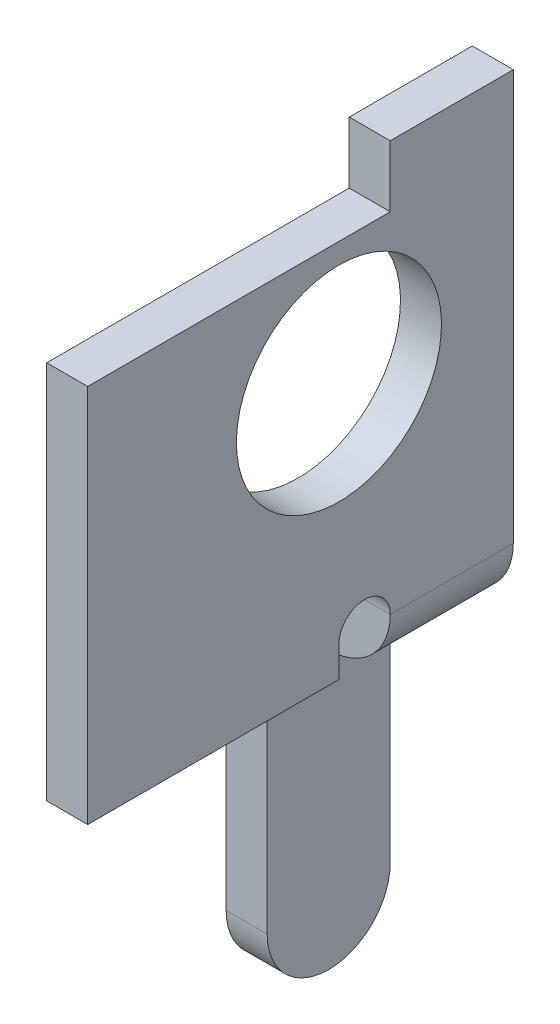
ISO-10303-21;
HEADER;
FILE_DESCRIPTION(('STEP AP214'),'2;1');
FILE_NAME('part.step','',(''),(''),'','','');
FILE_SCHEMA(('AUTOMOTIVE_DESIGN { 1 0 10303 214 1 1 1 1 }'));
ENDSEC;
DATA;
#1=APPLICATION_CONTEXT('core data for automotive mechanical design processes');
#2=APPLICATION_PROTOCOL_DEFINITION('international standard','automotive_design',2000,#1);
#3=PRODUCT_CONTEXT('',#1,'mechanical');
#4=PRODUCT('Part','Part','',(#3));
#5=PRODUCT_RELATED_PRODUCT_CATEGORY('part','',(#4));
#6=PRODUCT_DEFINITION_FORMATION('','',#4);
#7=PRODUCT_DEFINITION_CONTEXT('part definition',#1,'design');
#8=PRODUCT_DEFINITION('design','',#6,#7);
#9=PRODUCT_DEFINITION_SHAPE('','',#8);
#10=(LENGTH_UNIT() NAMED_UNIT(*) SI_UNIT(.MILLI.,.METRE.));
#11=(NAMED_UNIT(*) PLANE_ANGLE_UNIT() SI_UNIT($,.RADIAN.));
#12=(NAMED_UNIT(*) SI_UNIT($,.STERADIAN.) SOLID_ANGLE_UNIT());
#13=UNCERTAINTY_MEASURE_WITH_UNIT(LENGTH_MEASURE(1.E-05),#10,'distance_accuracy_value','');
#14=(GEOMETRIC_REPRESENTATION_CONTEXT(3) GLOBAL_UNCERTAINTY_ASSIGNED_CONTEXT((#13)) GLOBAL_UNIT_ASSIGNED_CONTEXT((#10,
#11,#12)) REPRESENTATION_CONTEXT('',''));
#15=CARTESIAN_POINT('',(0.,0.,0.));
#16=DIRECTION('',(0.,0.,1.));
#17=DIRECTION('',(1.,0.,0.));
#18=AXIS2_PLACEMENT_3D('',#15,#16,#17);
#19=CARTESIAN_POINT('',(-3.67305460142367,-0.513021259251257,-11.3));
#20=DIRECTION('',(0.,0.,-1.));
#21=DIRECTION('',(-1.,0.,0.));
#22=AXIS2_PLACEMENT_3D('',#19,#20,#21);
#23=PLANE('',#22);
#24=DIRECTION('',(0.,1.,0.));
#25=VECTOR('',#24,1.);
#26=CARTESIAN_POINT('',(-2.7,0.,-11.3));
#27=LINE('',#26,#25);
#28=CARTESIAN_POINT('',(-2.7,0.6,-11.3));
#29=VERTEX_POINT('',#28);
#30=CARTESIAN_POINT('',(-2.7,-1.9,-11.3));
#31=VERTEX_POINT('',#30);
#32=EDGE_CURVE('E163',#29,#31,#27,.F.);
#33=ORIENTED_EDGE('',*,*,#32,.F.);
#34=CARTESIAN_POINT('',(-2.5,0.6,-11.3));
#35=DIRECTION('',(0.,0.,1.));
#36=DIRECTION('',(1.,0.,0.));
#37=AXIS2_PLACEMENT_3D('',#34,#35,#36);
#38=CIRCLE('',#37,0.2);
#39=CARTESIAN_POINT('',(-2.5,0.8,-11.3));
#40=VERTEX_POINT('',#39);
#41=EDGE_CURVE('E169',#29,#40,#38,.F.);
#42=ORIENTED_EDGE('',*,*,#41,.T.);
#43=DIRECTION('',(-1.,0.,0.));
#44=VECTOR('',#43,1.);
#45=CARTESIAN_POINT('',(-3.67305460142367,0.8,-11.3));
#46=LINE('',#45,#44);
#47=CARTESIAN_POINT('',(-2.1,0.8,-11.3));
#48=VERTEX_POINT('',#47);
#49=EDGE_CURVE('E173',#48,#40,#46,.T.);
#50=ORIENTED_EDGE('',*,*,#49,.F.);
#51=CARTESIAN_POINT('',(-2.1,1.4,-11.3));
#52=DIRECTION('',(0.,0.,1.));
#53=DIRECTION('',(1.,0.,0.));
#54=AXIS2_PLACEMENT_3D('',#51,#52,#53);
#55=CIRCLE('',#54,0.6);
#56=CARTESIAN_POINT('',(-1.5,1.4,-11.3));
#57=VERTEX_POINT('',#56);
#58=EDGE_CURVE('E176',#57,#48,#55,.F.);
#59=ORIENTED_EDGE('',*,*,#58,.F.);
#60=DIRECTION('',(-1.,0.,0.));
#61=VECTOR('',#60,1.);
#62=CARTESIAN_POINT('',(-3.67305460142367,1.4,-11.3));
#63=LINE('',#62,#61);
#64=CARTESIAN_POINT('',(-1.9,1.4,-11.3));
#65=VERTEX_POINT('',#64);
#66=EDGE_CURVE('E177',#65,#57,#63,.F.);
#67=ORIENTED_EDGE('',*,*,#66,.F.);
#68=CARTESIAN_POINT('',(-2.1,1.4,-11.3));
#69=DIRECTION('',(0.,0.,1.));
#70=DIRECTION('',(1.,0.,0.));
#71=AXIS2_PLACEMENT_3D('',#68,#69,#70);
#72=CIRCLE('',#71,0.2);
#73=CARTESIAN_POINT('',(-2.1,1.2,-11.3));
#74=VERTEX_POINT('',#73);
#75=EDGE_CURVE('E179',#74,#65,#72,.T.);
#76=ORIENTED_EDGE('',*,*,#75,.F.);
#77=DIRECTION('',(-1.,0.,0.));
#78=VECTOR('',#77,1.);
#79=CARTESIAN_POINT('',(-3.67305460142367,1.2,-11.3));
#80=LINE('',#79,#78);
#81=CARTESIAN_POINT('',(-2.5,1.2,-11.3));
#82=VERTEX_POINT('',#81);
#83=EDGE_CURVE('E138',#82,#74,#80,.F.);
#84=ORIENTED_EDGE('',*,*,#83,.F.);
#85=CARTESIAN_POINT('',(-2.5,0.6,-11.3));
#86=DIRECTION('',(0.,0.,1.));
#87=DIRECTION('',(1.,0.,0.));
#88=AXIS2_PLACEMENT_3D('',#85,#86,#87);
#89=CIRCLE('',#88,0.6);
#90=CARTESIAN_POINT('',(-3.1,0.599999999999999,-11.3));
#91=VERTEX_POINT('',#90);
#92=EDGE_CURVE('E19',#91,#82,#89,.F.);
#93=ORIENTED_EDGE('',*,*,#92,.F.);
#94=DIRECTION('',(0.,1.,0.));
#95=VECTOR('',#94,1.);
#96=CARTESIAN_POINT('',(-3.1,0.599999999999996,-11.3));
#97=LINE('',#96,#95);
#98=CARTESIAN_POINT('',(-3.1,-1.9,-11.3));
#99=VERTEX_POINT('',#98);
#100=EDGE_CURVE('E135',#99,#91,#97,.T.);
#101=ORIENTED_EDGE('',*,*,#100,.F.);
#102=DIRECTION('',(-1.,0.,0.));
#103=VECTOR('',#102,1.);
#104=CARTESIAN_POINT('',(-4.5,-1.9,-11.3));
#105=LINE('',#104,#103);
#106=EDGE_CURVE('E170',#31,#99,#105,.T.);
#107=ORIENTED_EDGE('',*,*,#106,.F.);
#108=EDGE_LOOP('',(#33,#42,#50,#59,#67,#76,#84,#93,#101,#107));
#109=FACE_BOUND('',#108,.T.);
#110=ADVANCED_FACE('F16',(#109),#23,.F.);
#111=CARTESIAN_POINT('',(-4.5,-1.9,-11.9));
#112=DIRECTION('',(-1.,0.,0.));
#113=DIRECTION('',(0.,0.,1.));
#114=AXIS2_PLACEMENT_3D('',#111,#112,#113);
#115=CYLINDRICAL_SURFACE('',#114,0.6);
#116=DIRECTION('',(-1.,0.,0.));
#117=VECTOR('',#116,1.);
#118=CARTESIAN_POINT('',(-4.5,-1.9,-12.5));
#119=LINE('',#118,#117);
#120=CARTESIAN_POINT('',(-3.1,-1.9,-12.5));
#121=VERTEX_POINT('',#120);
#122=CARTESIAN_POINT('',(-2.7,-1.9,-12.5));
#123=VERTEX_POINT('',#122);
#124=EDGE_CURVE('E172',#121,#123,#119,.F.);
#125=ORIENTED_EDGE('',*,*,#124,.T.);
#126=CARTESIAN_POINT('',(-2.7,-1.9,-11.9));
#127=DIRECTION('',(-1.,0.,0.));
#128=DIRECTION('',(0.,0.,1.));
#129=AXIS2_PLACEMENT_3D('',#126,#127,#128);
#130=CIRCLE('',#129,0.6);
#131=EDGE_CURVE('E150',#31,#123,#130,.F.);
#132=ORIENTED_EDGE('',*,*,#131,.F.);
#133=ORIENTED_EDGE('',*,*,#106,.T.);
#134=CARTESIAN_POINT('',(-3.1,-1.9,-11.9));
#135=DIRECTION('',(-1.,0.,0.));
#136=DIRECTION('',(0.,0.,1.));
#137=AXIS2_PLACEMENT_3D('',#134,#135,#136);
#138=CIRCLE('',#137,0.6);
#139=EDGE_CURVE('E149',#121,#99,#138,.T.);
#140=ORIENTED_EDGE('',*,*,#139,.F.);
#141=EDGE_LOOP('',(#125,#132,#133,#140));
#142=FACE_BOUND('',#141,.T.);
#143=ADVANCED_FACE('F418',(#142),#115,.T.);
#144=CARTESIAN_POINT('',(-2.5,0.6,-11.3));
#145=DIRECTION('',(0.,0.,1.));
#146=DIRECTION('',(1.,0.,0.));
#147=AXIS2_PLACEMENT_3D('',#144,#145,#146);
#148=CYLINDRICAL_SURFACE('',#147,0.2);
#149=ORIENTED_EDGE('',*,*,#41,.F.);
#150=DIRECTION('',(0.,0.,1.));
#151=VECTOR('',#150,1.);
#152=CARTESIAN_POINT('',(-2.7,0.599999999999999,-11.3));
#153=LINE('',#152,#151);
#154=CARTESIAN_POINT('',(-2.7,0.6,-12.5));
#155=VERTEX_POINT('',#154);
#156=EDGE_CURVE('E166',#155,#29,#153,.T.);
#157=ORIENTED_EDGE('',*,*,#156,.F.);
#158=CARTESIAN_POINT('',(-2.5,0.6,-12.5));
#159=DIRECTION('',(0.,0.,1.));
#160=DIRECTION('',(1.,0.,0.));
#161=AXIS2_PLACEMENT_3D('',#158,#159,#160);
#162=CIRCLE('',#161,0.2);
#163=CARTESIAN_POINT('',(-2.5,0.8,-12.5));
#164=VERTEX_POINT('',#163);
#165=EDGE_CURVE('E200',#164,#155,#162,.T.);
#166=ORIENTED_EDGE('',*,*,#165,.F.);
#167=DIRECTION('',(0.,0.,1.));
#168=VECTOR('',#167,1.);
#169=CARTESIAN_POINT('',(-2.5,0.8,-11.3));
#170=LINE('',#169,#168);
#171=EDGE_CURVE('E234',#40,#164,#170,.F.);
#172=ORIENTED_EDGE('',*,*,#171,.F.);
#173=EDGE_LOOP('',(#149,#157,#166,#172));
#174=FACE_BOUND('',#173,.T.);
#175=ADVANCED_FACE('F415',(#174),#148,.F.);
#176=CARTESIAN_POINT('',(-2.7,0.,-11.3));
#177=DIRECTION('',(1.,0.,0.));
#178=DIRECTION('',(0.,1.,0.));
#179=AXIS2_PLACEMENT_3D('',#176,#177,#178);
#180=PLANE('',#179);
#181=ORIENTED_EDGE('',*,*,#32,.T.);
#182=ORIENTED_EDGE('',*,*,#131,.T.);
#183=DIRECTION('',(0.,1.,0.));
#184=VECTOR('',#183,1.);
#185=CARTESIAN_POINT('',(-2.7,-0.513021259251257,-12.5));
#186=LINE('',#185,#184);
#187=EDGE_CURVE('E203',#155,#123,#186,.F.);
#188=ORIENTED_EDGE('',*,*,#187,.F.);
#189=ORIENTED_EDGE('',*,*,#156,.T.);
#190=EDGE_LOOP('',(#181,#182,#188,#189));
#191=FACE_BOUND('',#190,.T.);
#192=ADVANCED_FACE('F412',(#191),#180,.T.);
#193=CARTESIAN_POINT('',(-3.1,0.599999999999996,-11.3));
#194=DIRECTION('',(-1.,0.,0.));
#195=DIRECTION('',(0.,0.,1.));
#196=AXIS2_PLACEMENT_3D('',#193,#194,#195);
#197=PLANE('',#196);
#198=DIRECTION('',(0.,1.,0.));
#199=VECTOR('',#198,1.);
#200=CARTESIAN_POINT('',(-3.1,-0.513021259251257,-12.5));
#201=LINE('',#200,#199);
#202=CARTESIAN_POINT('',(-3.1,0.599999999999999,-12.5));
#203=VERTEX_POINT('',#202);
#204=EDGE_CURVE('E199',#121,#203,#201,.T.);
#205=ORIENTED_EDGE('',*,*,#204,.F.);
#206=ORIENTED_EDGE('',*,*,#139,.T.);
#207=ORIENTED_EDGE('',*,*,#100,.T.);
#208=DIRECTION('',(0.,0.,1.));
#209=VECTOR('',#208,1.);
#210=CARTESIAN_POINT('',(-3.1,0.599999999999998,-11.3));
#211=LINE('',#210,#209);
#212=EDGE_CURVE('E146',#203,#91,#211,.T.);
#213=ORIENTED_EDGE('',*,*,#212,.F.);
#214=EDGE_LOOP('',(#205,#206,#207,#213));
#215=FACE_BOUND('',#214,.T.);
#216=ADVANCED_FACE('F145',(#215),#197,.T.);
#217=CARTESIAN_POINT('',(-2.5,0.6,-11.3));
#218=DIRECTION('',(0.,0.,1.));
#219=DIRECTION('',(1.,0.,0.));
#220=AXIS2_PLACEMENT_3D('',#217,#218,#219);
#221=CYLINDRICAL_SURFACE('',#220,0.6);
#222=CARTESIAN_POINT('',(-2.5,0.6,-12.5));
#223=DIRECTION('',(0.,0.,1.));
#224=DIRECTION('',(1.,0.,0.));
#225=AXIS2_PLACEMENT_3D('',#222,#223,#224);
#226=CIRCLE('',#225,0.6);
#227=CARTESIAN_POINT('',(-2.5,1.2,-12.5));
#228=VERTEX_POINT('',#227);
#229=EDGE_CURVE('E154',#203,#228,#226,.F.);
#230=ORIENTED_EDGE('',*,*,#229,.F.);
#231=ORIENTED_EDGE('',*,*,#212,.T.);
#232=ORIENTED_EDGE('',*,*,#92,.T.);
#233=DIRECTION('',(0.,0.,1.));
#234=VECTOR('',#233,1.);
#235=CARTESIAN_POINT('',(-2.49999999999999,1.2,-11.3));
#236=LINE('',#235,#234);
#237=EDGE_CURVE('E156',#228,#82,#236,.T.);
#238=ORIENTED_EDGE('',*,*,#237,.F.);
#239=EDGE_LOOP('',(#230,#231,#232,#238));
#240=FACE_BOUND('',#239,.T.);
#241=ADVANCED_FACE('F152',(#240),#221,.T.);
#242=CARTESIAN_POINT('',(-2.1,1.2,-11.3));
#243=DIRECTION('',(0.,1.,0.));
#244=DIRECTION('',(0.,0.,1.));
#245=AXIS2_PLACEMENT_3D('',#242,#243,#244);
#246=PLANE('',#245);
#247=DIRECTION('',(-1.,0.,0.));
#248=VECTOR('',#247,1.);
#249=CARTESIAN_POINT('',(-3.67305460142367,1.2,-12.5));
#250=LINE('',#249,#248);
#251=CARTESIAN_POINT('',(-2.1,1.2,-12.5));
#252=VERTEX_POINT('',#251);
#253=EDGE_CURVE('E197',#228,#252,#250,.F.);
#254=ORIENTED_EDGE('',*,*,#253,.F.);
#255=ORIENTED_EDGE('',*,*,#237,.T.);
#256=ORIENTED_EDGE('',*,*,#83,.T.);
#257=DIRECTION('',(0.,0.,1.));
#258=VECTOR('',#257,1.);
#259=CARTESIAN_POINT('',(-2.1,1.2,-11.3));
#260=LINE('',#259,#258);
#261=EDGE_CURVE('E158',#74,#252,#260,.F.);
#262=ORIENTED_EDGE('',*,*,#261,.T.);
#263=EDGE_LOOP('',(#254,#255,#256,#262));
#264=FACE_BOUND('',#263,.T.);
#265=ADVANCED_FACE('F405',(#264),#246,.T.);
#266=CARTESIAN_POINT('',(-2.1,1.4,-11.3));
#267=DIRECTION('',(0.,0.,1.));
#268=DIRECTION('',(1.,0.,0.));
#269=AXIS2_PLACEMENT_3D('',#266,#267,#268);
#270=CYLINDRICAL_SURFACE('',#269,0.2);
#271=ORIENTED_EDGE('',*,*,#75,.T.);
#272=DIRECTION('',(0.,0.,1.));
#273=VECTOR('',#272,1.);
#274=CARTESIAN_POINT('',(-1.9,1.4,-11.3));
#275=LINE('',#274,#273);
#276=CARTESIAN_POINT('',(-1.9,1.4,-12.5));
#277=VERTEX_POINT('',#276);
#278=EDGE_CURVE('E222',#277,#65,#275,.T.);
#279=ORIENTED_EDGE('',*,*,#278,.F.);
#280=CARTESIAN_POINT('',(-2.1,1.4,-12.5));
#281=DIRECTION('',(0.,0.,1.));
#282=DIRECTION('',(1.,0.,0.));
#283=AXIS2_PLACEMENT_3D('',#280,#281,#282);
#284=CIRCLE('',#283,0.2);
#285=EDGE_CURVE('E194',#252,#277,#284,.T.);
#286=ORIENTED_EDGE('',*,*,#285,.F.);
#287=ORIENTED_EDGE('',*,*,#261,.F.);
#288=EDGE_LOOP('',(#271,#279,#286,#287));
#289=FACE_BOUND('',#288,.T.);
#290=ADVANCED_FACE('F219',(#289),#270,.F.);
#291=CARTESIAN_POINT('',(-2.1,0.8,-11.3));
#292=DIRECTION('',(0.,-1.,0.));
#293=DIRECTION('',(1.,0.,0.));
#294=AXIS2_PLACEMENT_3D('',#291,#292,#293);
#295=PLANE('',#294);
#296=DIRECTION('',(-1.,0.,0.));
#297=VECTOR('',#296,1.);
#298=CARTESIAN_POINT('',(-3.67305460142367,0.8,-12.5));
#299=LINE('',#298,#297);
#300=CARTESIAN_POINT('',(-2.1,0.8,-12.5));
#301=VERTEX_POINT('',#300);
#302=EDGE_CURVE('E192',#301,#164,#299,.T.);
#303=ORIENTED_EDGE('',*,*,#302,.F.);
#304=DIRECTION('',(0.,0.,1.));
#305=VECTOR('',#304,1.);
#306=CARTESIAN_POINT('',(-2.1,0.8,-11.3));
#307=LINE('',#306,#305);
#308=EDGE_CURVE('E204',#48,#301,#307,.F.);
#309=ORIENTED_EDGE('',*,*,#308,.F.);
#310=ORIENTED_EDGE('',*,*,#49,.T.);
#311=ORIENTED_EDGE('',*,*,#171,.T.);
#312=EDGE_LOOP('',(#303,#309,#310,#311));
#313=FACE_BOUND('',#312,.T.);
#314=ADVANCED_FACE('F245',(#313),#295,.T.);
#315=CARTESIAN_POINT('',(-1.9,5.4,-11.3));
#316=DIRECTION('',(-1.,0.,0.));
#317=DIRECTION('',(0.,-1.,0.));
#318=AXIS2_PLACEMENT_3D('',#315,#316,#317);
#319=PLANE('',#318);
#320=DIRECTION('',(0.,1.,0.));
#321=VECTOR('',#320,1.);
#322=CARTESIAN_POINT('',(-1.9,4.8,-8.35));
#323=LINE('',#322,#321);
#324=CARTESIAN_POINT('',(-1.9,4.8,-8.35));
#325=VERTEX_POINT('',#324);
#326=CARTESIAN_POINT('',(-1.9,1.1,-8.35));
#327=VERTEX_POINT('',#326);
#328=EDGE_CURVE('E283',#325,#327,#323,.F.);
#329=ORIENTED_EDGE('',*,*,#328,.F.);
#330=DIRECTION('',(0.,0.,1.));
#331=VECTOR('',#330,1.);
#332=CARTESIAN_POINT('',(-1.9,4.8,-11.3));
#333=LINE('',#332,#331);
#334=CARTESIAN_POINT('',(-1.9,4.8,-11.3));
#335=VERTEX_POINT('',#334);
#336=EDGE_CURVE('E288',#335,#325,#333,.T.);
#337=ORIENTED_EDGE('',*,*,#336,.F.);
#338=DIRECTION('',(0.,1.,0.));
#339=VECTOR('',#338,1.);
#340=CARTESIAN_POINT('',(-1.9,-0.513021259251257,-11.3));
#341=LINE('',#340,#339);
#342=CARTESIAN_POINT('',(-1.9,5.4,-11.3));
#343=VERTEX_POINT('',#342);
#344=EDGE_CURVE('E293',#335,#343,#341,.T.);
#345=ORIENTED_EDGE('',*,*,#344,.T.);
#346=DIRECTION('',(0.,0.,1.));
#347=VECTOR('',#346,1.);
#348=CARTESIAN_POINT('',(-1.9,5.4,-11.3));
#349=LINE('',#348,#347);
#350=CARTESIAN_POINT('',(-1.9,5.4,-12.5));
#351=VERTEX_POINT('',#350);
#352=EDGE_CURVE('E262',#351,#343,#349,.T.);
#353=ORIENTED_EDGE('',*,*,#352,.F.);
#354=DIRECTION('',(0.,1.,0.));
#355=VECTOR('',#354,1.);
#356=CARTESIAN_POINT('',(-1.9,-0.513021259251257,-12.5));
#357=LINE('',#356,#355);
#358=EDGE_CURVE('E193',#277,#351,#357,.T.);
#359=ORIENTED_EDGE('',*,*,#358,.F.);
#360=ORIENTED_EDGE('',*,*,#278,.T.);
#361=CARTESIAN_POINT('',(-1.9,1.4,-11.05));
#362=DIRECTION('',(1.,0.,0.));
#363=DIRECTION('',(0.,0.,-1.));
#364=AXIS2_PLACEMENT_3D('',#361,#362,#363);
#365=CIRCLE('',#364,0.25);
#366=CARTESIAN_POINT('',(-1.9,1.4,-10.8));
#367=VERTEX_POINT('',#366);
#368=EDGE_CURVE('E205',#65,#367,#365,.T.);
#369=ORIENTED_EDGE('',*,*,#368,.T.);
#370=DIRECTION('',(0.,-1.,0.));
#371=VECTOR('',#370,1.);
#372=CARTESIAN_POINT('',(-1.9,5.4,-10.8));
#373=LINE('',#372,#371);
#374=CARTESIAN_POINT('',(-1.9,1.1,-10.8));
#375=VERTEX_POINT('',#374);
#376=EDGE_CURVE('E210',#367,#375,#373,.T.);
#377=ORIENTED_EDGE('',*,*,#376,.T.);
#378=DIRECTION('',(0.,0.,1.));
#379=VECTOR('',#378,1.);
#380=CARTESIAN_POINT('',(-1.9,1.1,-8.35));
#381=LINE('',#380,#379);
#382=EDGE_CURVE('E275',#327,#375,#381,.F.);
#383=ORIENTED_EDGE('',*,*,#382,.F.);
#384=EDGE_LOOP('',(#329,#337,#345,#353,#359,#360,#369,#377,#383));
#385=FACE_BOUND('',#384,.T.);
#386=CARTESIAN_POINT('',(-1.9,3.6,-10.8));
#387=DIRECTION('',(1.,0.,0.));
#388=DIRECTION('',(0.,1.,0.));
#389=AXIS2_PLACEMENT_3D('',#386,#387,#388);
#390=CIRCLE('',#389,0.999999999999999);
#391=CARTESIAN_POINT('',(-1.9,4.6,-10.8));
#392=VERTEX_POINT('',#391);
#393=EDGE_CURVE('E208',#392,#392,#390,.T.);
#394=ORIENTED_EDGE('',*,*,#393,.T.);
#395=EDGE_LOOP('',(#394));
#396=FACE_BOUND('',#395,.T.);
#397=ADVANCED_FACE('F231',(#385,#396),#319,.T.);
#398=CARTESIAN_POINT('',(1.32842712474619,3.6,-10.8));
#399=DIRECTION('',(1.,0.,0.));
#400=DIRECTION('',(0.,1.,0.));
#401=AXIS2_PLACEMENT_3D('',#398,#399,#400);
#402=CYLINDRICAL_SURFACE('',#401,0.999999999999999);
#403=ORIENTED_EDGE('',*,*,#393,.F.);
#404=EDGE_LOOP('',(#403));
#405=FACE_BOUND('',#404,.T.);
#406=CARTESIAN_POINT('',(-1.5,3.6,-10.8));
#407=DIRECTION('',(1.,0.,0.));
#408=DIRECTION('',(0.,1.,0.));
#409=AXIS2_PLACEMENT_3D('',#406,#407,#408);
#410=CIRCLE('',#409,0.999999999999999);
#411=CARTESIAN_POINT('',(-1.5,4.6,-10.8));
#412=VERTEX_POINT('',#411);
#413=EDGE_CURVE('E185',#412,#412,#410,.F.);
#414=ORIENTED_EDGE('',*,*,#413,.F.);
#415=EDGE_LOOP('',(#414));
#416=FACE_BOUND('',#415,.T.);
#417=ADVANCED_FACE('F395',(#405,#416),#402,.F.);
#418=CARTESIAN_POINT('',(3.23207142803234,1.4,-11.05));
#419=DIRECTION('',(1.,0.,0.));
#420=DIRECTION('',(0.,0.,-1.));
#421=AXIS2_PLACEMENT_3D('',#418,#419,#420);
#422=CYLINDRICAL_SURFACE('',#421,0.25);
#423=DIRECTION('',(1.,0.,0.));
#424=VECTOR('',#423,1.);
#425=CARTESIAN_POINT('',(3.23207142803234,1.4,-10.8));
#426=LINE('',#425,#424);
#427=CARTESIAN_POINT('',(-1.5,1.4,-10.8));
#428=VERTEX_POINT('',#427);
#429=EDGE_CURVE('E188',#367,#428,#426,.T.);
#430=ORIENTED_EDGE('',*,*,#429,.F.);
#431=ORIENTED_EDGE('',*,*,#368,.F.);
#432=ORIENTED_EDGE('',*,*,#66,.T.);
#433=CARTESIAN_POINT('',(-1.5,1.4,-11.05));
#434=DIRECTION('',(1.,0.,0.));
#435=DIRECTION('',(0.,0.,-1.));
#436=AXIS2_PLACEMENT_3D('',#433,#434,#435);
#437=CIRCLE('',#436,0.25);
#438=EDGE_CURVE('E181',#428,#57,#437,.F.);
#439=ORIENTED_EDGE('',*,*,#438,.F.);
#440=EDGE_LOOP('',(#430,#431,#432,#439));
#441=FACE_BOUND('',#440,.T.);
#442=ADVANCED_FACE('F227',(#441),#422,.F.);
#443=CARTESIAN_POINT('',(-2.1,1.4,-11.3));
#444=DIRECTION('',(0.,0.,1.));
#445=DIRECTION('',(1.,0.,0.));
#446=AXIS2_PLACEMENT_3D('',#443,#444,#445);
#447=CYLINDRICAL_SURFACE('',#446,0.6);
#448=CARTESIAN_POINT('',(-2.1,1.4,-12.5));
#449=DIRECTION('',(0.,0.,1.));
#450=DIRECTION('',(1.,0.,0.));
#451=AXIS2_PLACEMENT_3D('',#448,#449,#450);
#452=CIRCLE('',#451,0.6);
#453=CARTESIAN_POINT('',(-1.5,1.4,-12.5));
#454=VERTEX_POINT('',#453);
#455=EDGE_CURVE('E189',#454,#301,#452,.F.);
#456=ORIENTED_EDGE('',*,*,#455,.F.);
#457=DIRECTION('',(0.,0.,1.));
#458=VECTOR('',#457,1.);
#459=CARTESIAN_POINT('',(-1.5,1.4,-11.3));
#460=LINE('',#459,#458);
#461=EDGE_CURVE('E184',#57,#454,#460,.F.);
#462=ORIENTED_EDGE('',*,*,#461,.F.);
#463=ORIENTED_EDGE('',*,*,#58,.T.);
#464=ORIENTED_EDGE('',*,*,#308,.T.);
#465=EDGE_LOOP('',(#456,#462,#463,#464));
#466=FACE_BOUND('',#465,.T.);
#467=ADVANCED_FACE('F241',(#466),#447,.T.);
#468=CARTESIAN_POINT('',(-3.67305460142367,-0.513021259251257,-12.5));
#469=DIRECTION('',(0.,0.,-1.));
#470=DIRECTION('',(-1.,0.,0.));
#471=AXIS2_PLACEMENT_3D('',#468,#469,#470);
#472=PLANE('',#471);
#473=ORIENTED_EDGE('',*,*,#455,.T.);
#474=ORIENTED_EDGE('',*,*,#302,.T.);
#475=ORIENTED_EDGE('',*,*,#165,.T.);
#476=ORIENTED_EDGE('',*,*,#187,.T.);
#477=ORIENTED_EDGE('',*,*,#124,.F.);
#478=ORIENTED_EDGE('',*,*,#204,.T.);
#479=ORIENTED_EDGE('',*,*,#229,.T.);
#480=ORIENTED_EDGE('',*,*,#253,.T.);
#481=ORIENTED_EDGE('',*,*,#285,.T.);
#482=ORIENTED_EDGE('',*,*,#358,.T.);
#483=DIRECTION('',(1.,0.,0.));
#484=VECTOR('',#483,1.);
#485=CARTESIAN_POINT('',(-1.5,5.4,-12.5));
#486=LINE('',#485,#484);
#487=CARTESIAN_POINT('',(-1.5,5.4,-12.5));
#488=VERTEX_POINT('',#487);
#489=EDGE_CURVE('E259',#488,#351,#486,.F.);
#490=ORIENTED_EDGE('',*,*,#489,.F.);
#491=DIRECTION('',(0.,1.,0.));
#492=VECTOR('',#491,1.);
#493=CARTESIAN_POINT('',(-1.5,5.4,-12.5));
#494=LINE('',#493,#492);
#495=EDGE_CURVE('E322',#454,#488,#494,.T.);
#496=ORIENTED_EDGE('',*,*,#495,.F.);
#497=EDGE_LOOP('',(#473,#474,#475,#476,#477,#478,#479,#480,#481,#482,#490,#496));
#498=FACE_BOUND('',#497,.T.);
#499=ADVANCED_FACE('F256',(#498),#472,.T.);
#500=CARTESIAN_POINT('',(-1.5,5.4,-11.3));
#501=DIRECTION('',(0.,1.,0.));
#502=DIRECTION('',(0.,0.,1.));
#503=AXIS2_PLACEMENT_3D('',#500,#501,#502);
#504=PLANE('',#503);
#505=ORIENTED_EDGE('',*,*,#489,.T.);
#506=ORIENTED_EDGE('',*,*,#352,.T.);
#507=DIRECTION('',(-1.,0.,0.));
#508=VECTOR('',#507,1.);
#509=CARTESIAN_POINT('',(-3.67305460142367,5.4,-11.3));
#510=LINE('',#509,#508);
#511=CARTESIAN_POINT('',(-1.5,5.4,-11.3));
#512=VERTEX_POINT('',#511);
#513=EDGE_CURVE('E295',#343,#512,#510,.F.);
#514=ORIENTED_EDGE('',*,*,#513,.T.);
#515=DIRECTION('',(0.,0.,1.));
#516=VECTOR('',#515,1.);
#517=CARTESIAN_POINT('',(-1.5,5.4,-11.3));
#518=LINE('',#517,#516);
#519=EDGE_CURVE('E320',#488,#512,#518,.T.);
#520=ORIENTED_EDGE('',*,*,#519,.F.);
#521=EDGE_LOOP('',(#505,#506,#514,#520));
#522=FACE_BOUND('',#521,.T.);
#523=ADVANCED_FACE('F302',(#522),#504,.T.);
#524=CARTESIAN_POINT('',(-3.67305460142367,-0.513021259251257,-11.3));
#525=DIRECTION('',(0.,0.,-1.));
#526=DIRECTION('',(-1.,0.,0.));
#527=AXIS2_PLACEMENT_3D('',#524,#525,#526);
#528=PLANE('',#527);
#529=DIRECTION('',(0.,1.,0.));
#530=VECTOR('',#529,1.);
#531=CARTESIAN_POINT('',(-1.5,5.4,-11.3));
#532=LINE('',#531,#530);
#533=CARTESIAN_POINT('',(-1.5,4.8,-11.3));
#534=VERTEX_POINT('',#533);
#535=EDGE_CURVE('E309',#512,#534,#532,.F.);
#536=ORIENTED_EDGE('',*,*,#535,.F.);
#537=ORIENTED_EDGE('',*,*,#513,.F.);
#538=ORIENTED_EDGE('',*,*,#344,.F.);
#539=DIRECTION('',(1.,0.,0.));
#540=VECTOR('',#539,1.);
#541=CARTESIAN_POINT('',(3.23207142803234,4.8,-11.3));
#542=LINE('',#541,#540);
#543=EDGE_CURVE('E290',#534,#335,#542,.F.);
#544=ORIENTED_EDGE('',*,*,#543,.F.);
#545=EDGE_LOOP('',(#536,#537,#538,#544));
#546=FACE_BOUND('',#545,.T.);
#547=ADVANCED_FACE('F306',(#546),#528,.F.);
#548=CARTESIAN_POINT('',(3.23207142803234,4.8,-11.3));
#549=DIRECTION('',(0.,1.,0.));
#550=DIRECTION('',(0.,0.,1.));
#551=AXIS2_PLACEMENT_3D('',#548,#549,#550);
#552=PLANE('',#551);
#553=DIRECTION('',(1.,0.,0.));
#554=VECTOR('',#553,1.);
#555=CARTESIAN_POINT('',(3.23207142803234,4.8,-8.35));
#556=LINE('',#555,#554);
#557=CARTESIAN_POINT('',(-1.5,4.8,-8.35));
#558=VERTEX_POINT('',#557);
#559=EDGE_CURVE('E285',#558,#325,#556,.F.);
#560=ORIENTED_EDGE('',*,*,#559,.F.);
#561=DIRECTION('',(0.,0.,1.));
#562=VECTOR('',#561,1.);
#563=CARTESIAN_POINT('',(-1.5,4.8,-11.3));
#564=LINE('',#563,#562);
#565=EDGE_CURVE('E347',#534,#558,#564,.T.);
#566=ORIENTED_EDGE('',*,*,#565,.F.);
#567=ORIENTED_EDGE('',*,*,#543,.T.);
#568=ORIENTED_EDGE('',*,*,#336,.T.);
#569=EDGE_LOOP('',(#560,#566,#567,#568));
#570=FACE_BOUND('',#569,.T.);
#571=ADVANCED_FACE('F364',(#570),#552,.T.);
#572=CARTESIAN_POINT('',(3.23207142803234,4.8,-8.35));
#573=DIRECTION('',(0.,0.,1.));
#574=DIRECTION('',(1.,0.,0.));
#575=AXIS2_PLACEMENT_3D('',#572,#573,#574);
#576=PLANE('',#575);
#577=DIRECTION('',(1.,0.,0.));
#578=VECTOR('',#577,1.);
#579=CARTESIAN_POINT('',(3.23207142803234,1.1,-8.35));
#580=LINE('',#579,#578);
#581=CARTESIAN_POINT('',(-1.5,1.1,-8.35));
#582=VERTEX_POINT('',#581);
#583=EDGE_CURVE('E277',#582,#327,#580,.F.);
#584=ORIENTED_EDGE('',*,*,#583,.F.);
#585=DIRECTION('',(0.,1.,0.));
#586=VECTOR('',#585,1.);
#587=CARTESIAN_POINT('',(-1.5,5.4,-8.35));
#588=LINE('',#587,#586);
#589=EDGE_CURVE('E338',#558,#582,#588,.F.);
#590=ORIENTED_EDGE('',*,*,#589,.F.);
#591=ORIENTED_EDGE('',*,*,#559,.T.);
#592=ORIENTED_EDGE('',*,*,#328,.T.);
#593=EDGE_LOOP('',(#584,#590,#591,#592));
#594=FACE_BOUND('',#593,.T.);
#595=ADVANCED_FACE('F366',(#594),#576,.T.);
#596=CARTESIAN_POINT('',(3.23207142803234,1.1,-8.35));
#597=DIRECTION('',(0.,-1.,0.));
#598=DIRECTION('',(1.,0.,0.));
#599=AXIS2_PLACEMENT_3D('',#596,#597,#598);
#600=PLANE('',#599);
#601=DIRECTION('',(1.,0.,0.));
#602=VECTOR('',#601,1.);
#603=CARTESIAN_POINT('',(3.23207142803234,1.1,-10.8));
#604=LINE('',#603,#602);
#605=CARTESIAN_POINT('',(-1.5,1.1,-10.8));
#606=VERTEX_POINT('',#605);
#607=EDGE_CURVE('E34',#606,#375,#604,.F.);
#608=ORIENTED_EDGE('',*,*,#607,.F.);
#609=DIRECTION('',(0.,0.,1.));
#610=VECTOR('',#609,1.);
#611=CARTESIAN_POINT('',(-1.5,1.1,-11.3));
#612=LINE('',#611,#610);
#613=EDGE_CURVE('E25',#582,#606,#612,.F.);
#614=ORIENTED_EDGE('',*,*,#613,.F.);
#615=ORIENTED_EDGE('',*,*,#583,.T.);
#616=ORIENTED_EDGE('',*,*,#382,.T.);
#617=EDGE_LOOP('',(#608,#614,#615,#616));
#618=FACE_BOUND('',#617,.T.);
#619=ADVANCED_FACE('F368',(#618),#600,.T.);
#620=CARTESIAN_POINT('',(3.23207142803234,1.1,-10.8));
#621=DIRECTION('',(0.,0.,-1.));
#622=DIRECTION('',(0.,1.,0.));
#623=AXIS2_PLACEMENT_3D('',#620,#621,#622);
#624=PLANE('',#623);
#625=ORIENTED_EDGE('',*,*,#429,.T.);
#626=DIRECTION('',(0.,1.,0.));
#627=VECTOR('',#626,1.);
#628=CARTESIAN_POINT('',(-1.5,5.4,-10.8));
#629=LINE('',#628,#627);
#630=EDGE_CURVE('E11',#606,#428,#629,.T.);
#631=ORIENTED_EDGE('',*,*,#630,.F.);
#632=ORIENTED_EDGE('',*,*,#607,.T.);
#633=ORIENTED_EDGE('',*,*,#376,.F.);
#634=EDGE_LOOP('',(#625,#631,#632,#633));
#635=FACE_BOUND('',#634,.T.);
#636=ADVANCED_FACE('F370',(#635),#624,.T.);
#637=CARTESIAN_POINT('',(-1.5,5.4,-11.3));
#638=DIRECTION('',(1.,0.,0.));
#639=DIRECTION('',(0.,1.,0.));
#640=AXIS2_PLACEMENT_3D('',#637,#638,#639);
#641=PLANE('',#640);
#642=ORIENTED_EDGE('',*,*,#613,.T.);
#643=ORIENTED_EDGE('',*,*,#630,.T.);
#644=ORIENTED_EDGE('',*,*,#438,.T.);
#645=ORIENTED_EDGE('',*,*,#461,.T.);
#646=ORIENTED_EDGE('',*,*,#495,.T.);
#647=ORIENTED_EDGE('',*,*,#519,.T.);
#648=ORIENTED_EDGE('',*,*,#535,.T.);
#649=ORIENTED_EDGE('',*,*,#565,.T.);
#650=ORIENTED_EDGE('',*,*,#589,.T.);
#651=EDGE_LOOP('',(#642,#643,#644,#645,#646,#647,#648,#649,#650));
#652=FACE_BOUND('',#651,.T.);
#653=ORIENTED_EDGE('',*,*,#413,.T.);
#654=EDGE_LOOP('',(#653));
#655=FACE_BOUND('',#654,.T.);
#656=ADVANCED_FACE('F359',(#652,#655),#641,.T.);
#657=CLOSED_SHELL('',(#110,#143,#175,#192,#216,#241,#265,#290,#314,#397,#417,#442,#467,#499,
#523,#547,#571,#595,#619,#636,#656));
#658=MANIFOLD_SOLID_BREP('B1',#657);
#659=ADVANCED_BREP_SHAPE_REPRESENTATION('',(#18,#658),#14);
#660=SHAPE_DEFINITION_REPRESENTATION(#9,#659);
ENDSEC;
END-ISO-10303-21;
